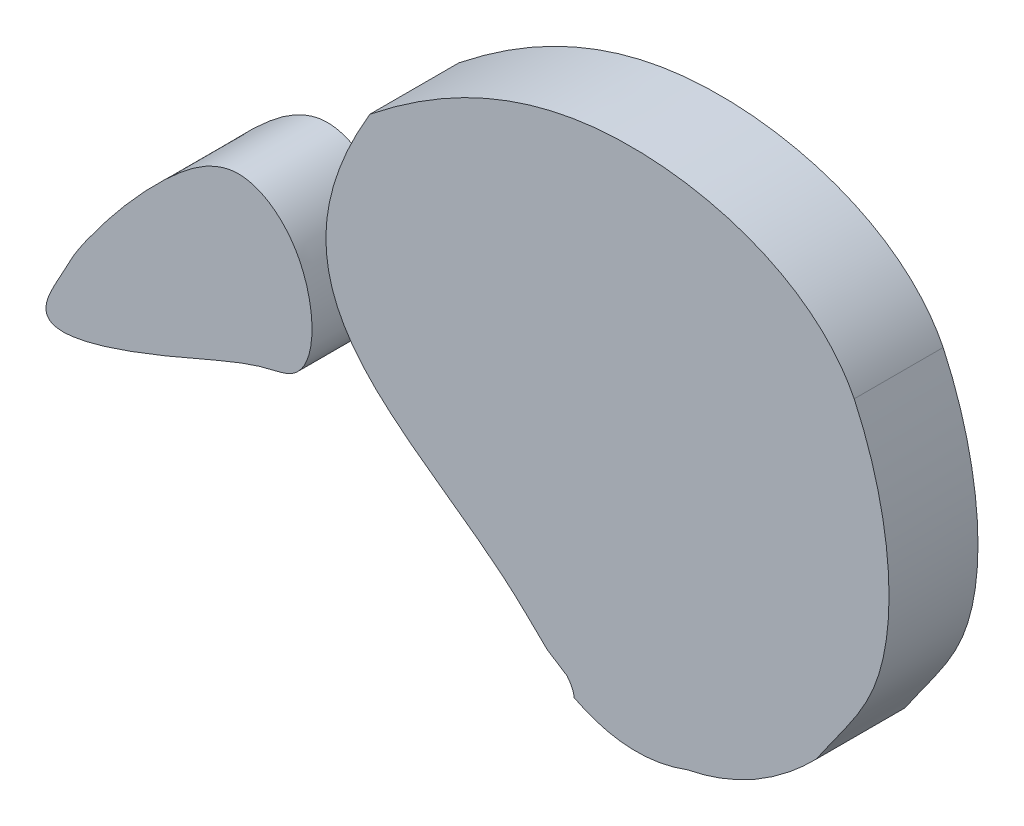
ISO-10303-21;
HEADER;
FILE_DESCRIPTION(('STEP AP214'),'2;1');
FILE_NAME('part.step','',(''),(''),'','','');
FILE_SCHEMA(('AUTOMOTIVE_DESIGN { 1 0 10303 214 1 1 1 1 }'));
ENDSEC;
DATA;
#1=APPLICATION_CONTEXT('core data for automotive mechanical design processes');
#2=APPLICATION_PROTOCOL_DEFINITION('international standard','automotive_design',2000,#1);
#3=PRODUCT_CONTEXT('',#1,'mechanical');
#4=PRODUCT('Part','Part','',(#3));
#5=PRODUCT_RELATED_PRODUCT_CATEGORY('part','',(#4));
#6=PRODUCT_DEFINITION_FORMATION('','',#4);
#7=PRODUCT_DEFINITION_CONTEXT('part definition',#1,'design');
#8=PRODUCT_DEFINITION('design','',#6,#7);
#9=PRODUCT_DEFINITION_SHAPE('','',#8);
#10=(LENGTH_UNIT() NAMED_UNIT(*) SI_UNIT(.MILLI.,.METRE.));
#11=(NAMED_UNIT(*) PLANE_ANGLE_UNIT() SI_UNIT($,.RADIAN.));
#12=(NAMED_UNIT(*) SI_UNIT($,.STERADIAN.) SOLID_ANGLE_UNIT());
#13=UNCERTAINTY_MEASURE_WITH_UNIT(LENGTH_MEASURE(1.E-05),#10,'distance_accuracy_value','');
#14=(GEOMETRIC_REPRESENTATION_CONTEXT(3) GLOBAL_UNCERTAINTY_ASSIGNED_CONTEXT((#13)) GLOBAL_UNIT_ASSIGNED_CONTEXT((#10,
#11,#12)) REPRESENTATION_CONTEXT('',''));
#15=CARTESIAN_POINT('',(0.,0.,0.));
#16=DIRECTION('',(0.,0.,1.));
#17=DIRECTION('',(1.,0.,0.));
#18=AXIS2_PLACEMENT_3D('',#15,#16,#17);
#19=CARTESIAN_POINT('',(-28.3902423523311,28.8973090137237,9.8));
#20=CARTESIAN_POINT('',(-26.5713886592162,31.4632090979087,9.8));
#21=CARTESIAN_POINT('',(-20.9532124526466,38.7162418127527,9.8));
#22=CARTESIAN_POINT('',(-11.8905383457723,45.2867117471239,9.8));
#23=CARTESIAN_POINT('',(-3.10016941693718,39.2693637235746,9.8));
#24=CARTESIAN_POINT('',(-2.78927548090348,27.4293616295983,9.8));
#25=CARTESIAN_POINT('',(-9.74025662267519,26.5320450092498,9.8));
#26=CARTESIAN_POINT('',(-38.710808990714,13.4203526333964,9.8));
#27=CARTESIAN_POINT('',(-31.5508679983338,22.6874814932975,9.8));
#28=CARTESIAN_POINT('',(-30.056508931191,26.5466671940129,9.8));
#29=CARTESIAN_POINT('',(-28.3902423523311,28.8973090137237,9.8));
#30=B_SPLINE_CURVE_WITH_KNOTS('',3,(#19,#20,#21,#22,#23,#24,#25,#26,#27,#28,#29),.UNSPECIFIED.,
.T.,.F.,(4,1,1,1,1,1,1,1,4),(0.,0.120347822003334,0.195890843614702,0.256651724543317,
0.359848027807498,0.390374162528509,0.443364198438644,0.889748386908841,1.),.UNSPECIFIED.);
#31=DIRECTION('',(0.,0.,-1.));
#32=VECTOR('',#31,1.);
#33=SURFACE_OF_LINEAR_EXTRUSION('',#30,#32);
#34=CARTESIAN_POINT('',(-28.3902423523311,28.8973090137237,9.8));
#35=VERTEX_POINT('',#34);
#36=EDGE_CURVE('E12',#35,#35,#30,.T.);
#37=ORIENTED_EDGE('',*,*,#36,.T.);
#38=EDGE_LOOP('',(#37));
#39=FACE_BOUND('',#38,.T.);
#40=CARTESIAN_POINT('',(-28.3902423523311,28.8973090137237,0.));
#41=CARTESIAN_POINT('',(-26.5713886592162,31.4632090979087,0.));
#42=CARTESIAN_POINT('',(-20.9532124526466,38.7162418127527,0.));
#43=CARTESIAN_POINT('',(-11.8905383457723,45.2867117471239,0.));
#44=CARTESIAN_POINT('',(-3.10016941693718,39.2693637235746,0.));
#45=CARTESIAN_POINT('',(-2.78927548090348,27.4293616295983,0.));
#46=CARTESIAN_POINT('',(-9.74025662267519,26.5320450092498,0.));
#47=CARTESIAN_POINT('',(-38.710808990714,13.4203526333964,0.));
#48=CARTESIAN_POINT('',(-31.5508679983338,22.6874814932975,0.));
#49=CARTESIAN_POINT('',(-30.056508931191,26.5466671940129,0.));
#50=CARTESIAN_POINT('',(-28.3902423523311,28.8973090137237,0.));
#51=B_SPLINE_CURVE_WITH_KNOTS('',3,(#40,#41,#42,#43,#44,#45,#46,#47,#48,#49,#50),.UNSPECIFIED.,
.T.,.F.,(4,1,1,1,1,1,1,1,4),(0.,0.120347822003334,0.195890843614702,0.256651724543317,
0.359848027807498,0.390374162528509,0.443364198438644,0.889748386908841,1.),.UNSPECIFIED.);
#52=CARTESIAN_POINT('',(-28.3902423523311,28.8973090137237,0.));
#53=VERTEX_POINT('',#52);
#54=EDGE_CURVE('E118',#53,#53,#51,.T.);
#55=ORIENTED_EDGE('',*,*,#54,.F.);
#56=EDGE_LOOP('',(#55));
#57=FACE_BOUND('',#56,.T.);
#58=ADVANCED_FACE('F114',(#39,#57),#33,.T.);
#59=CARTESIAN_POINT('',(0.,0.,9.8));
#60=DIRECTION('',(0.,0.,1.));
#61=DIRECTION('',(1.,0.,0.));
#62=AXIS2_PLACEMENT_3D('',#59,#60,#61);
#63=PLANE('',#62);
#64=ORIENTED_EDGE('',*,*,#36,.F.);
#65=EDGE_LOOP('',(#64));
#66=FACE_BOUND('',#65,.T.);
#67=ADVANCED_FACE('F137',(#66),#63,.T.);
#68=CARTESIAN_POINT('',(0.,0.,0.));
#69=DIRECTION('',(0.,0.,1.));
#70=DIRECTION('',(1.,0.,0.));
#71=AXIS2_PLACEMENT_3D('',#68,#69,#70);
#72=PLANE('',#71);
#73=ORIENTED_EDGE('',*,*,#54,.T.);
#74=EDGE_LOOP('',(#73));
#75=FACE_BOUND('',#74,.T.);
#76=ADVANCED_FACE('F134',(#75),#72,.F.);
#77=CLOSED_SHELL('',(#58,#67,#76));
#78=MANIFOLD_SOLID_BREP('B2',#77);
#79=CARTESIAN_POINT('',(37.8211398357284,11.4277403449907,9.8));
#80=CARTESIAN_POINT('',(31.2983827616135,8.97429833467415,9.8));
#81=CARTESIAN_POINT('',(25.2975764639562,12.0537958425906,9.8));
#82=B_SPLINE_CURVE_WITH_KNOTS('',2,(#79,#80,#81),.UNSPECIFIED.,.F.,.F.,(3,3),(0.,1.),.UNSPECIFIED.);
#83=DIRECTION('',(0.,0.,-1.));
#84=VECTOR('',#83,1.);
#85=SURFACE_OF_LINEAR_EXTRUSION('',#82,#84);
#86=CARTESIAN_POINT('',(37.8211398357284,11.4277403449907,0.));
#87=CARTESIAN_POINT('',(31.2983827616135,8.97429833467415,0.));
#88=CARTESIAN_POINT('',(25.2975764639562,12.0537958425906,0.));
#89=B_SPLINE_CURVE_WITH_KNOTS('',2,(#86,#87,#88),.UNSPECIFIED.,.F.,.F.,(3,3),(0.,1.),.UNSPECIFIED.);
#90=CARTESIAN_POINT('',(37.8211398357284,11.4277403449907,0.));
#91=VERTEX_POINT('',#90);
#92=CARTESIAN_POINT('',(25.2975764644121,12.0537958391927,0.));
#93=VERTEX_POINT('',#92);
#94=EDGE_CURVE('E324',#91,#93,#89,.T.);
#95=ORIENTED_EDGE('',*,*,#94,.F.);
#96=DIRECTION('',(0.,0.,-1.));
#97=VECTOR('',#96,1.);
#98=CARTESIAN_POINT('',(37.8211398357284,11.4277403449907,9.8));
#99=LINE('',#98,#97);
#100=CARTESIAN_POINT('',(37.8211398357284,11.4277403449907,9.8));
#101=VERTEX_POINT('',#100);
#102=EDGE_CURVE('E112',#101,#91,#99,.T.);
#103=ORIENTED_EDGE('',*,*,#102,.F.);
#104=CARTESIAN_POINT('',(25.2975764644121,12.0537958391927,9.8));
#105=VERTEX_POINT('',#104);
#106=EDGE_CURVE('E301',#101,#105,#82,.T.);
#107=ORIENTED_EDGE('',*,*,#106,.T.);
#108=DIRECTION('',(0.,0.,-1.));
#109=VECTOR('',#108,1.);
#110=CARTESIAN_POINT('',(25.2975764644121,12.0537958391927,9.8));
#111=LINE('',#110,#109);
#112=EDGE_CURVE('E217',#105,#93,#111,.T.);
#113=ORIENTED_EDGE('',*,*,#112,.T.);
#114=EDGE_LOOP('',(#95,#103,#107,#113));
#115=FACE_BOUND('',#114,.T.);
#116=ADVANCED_FACE('F168',(#115),#85,.T.);
#117=CARTESIAN_POINT('',(37.8211398357284,11.4277403449907,9.8));
#118=CARTESIAN_POINT('',(45.4854131323933,12.9577844561298,9.8));
#119=CARTESIAN_POINT('',(51.9460569732645,19.5146957271996,9.8));
#120=B_SPLINE_CURVE_WITH_KNOTS('',2,(#117,#118,#119),.UNSPECIFIED.,.F.,.F.,(3,3),
(0.435157314223848,1.),.UNSPECIFIED.);
#121=DIRECTION('',(0.,0.,-1.));
#122=VECTOR('',#121,1.);
#123=SURFACE_OF_LINEAR_EXTRUSION('',#120,#122);
#124=CARTESIAN_POINT('',(37.8211398357284,11.4277403449907,0.));
#125=CARTESIAN_POINT('',(45.4854131323933,12.9577844561298,0.));
#126=CARTESIAN_POINT('',(51.9460569732645,19.5146957271996,0.));
#127=B_SPLINE_CURVE_WITH_KNOTS('',2,(#124,#125,#126),.UNSPECIFIED.,.F.,.F.,(3,3),
(0.435157314223848,1.),.UNSPECIFIED.);
#128=CARTESIAN_POINT('',(51.9460569732645,19.5146957271996,0.));
#129=VERTEX_POINT('',#128);
#130=EDGE_CURVE('E319',#91,#129,#127,.T.);
#131=ORIENTED_EDGE('',*,*,#130,.T.);
#132=DIRECTION('',(0.,0.,-1.));
#133=VECTOR('',#132,1.);
#134=CARTESIAN_POINT('',(51.9460569732645,19.5146957271996,9.8));
#135=LINE('',#134,#133);
#136=CARTESIAN_POINT('',(51.9460569732645,19.5146957271996,9.8));
#137=VERTEX_POINT('',#136);
#138=EDGE_CURVE('E177',#137,#129,#135,.T.);
#139=ORIENTED_EDGE('',*,*,#138,.F.);
#140=EDGE_CURVE('E294',#101,#137,#120,.T.);
#141=ORIENTED_EDGE('',*,*,#140,.F.);
#142=ORIENTED_EDGE('',*,*,#102,.T.);
#143=EDGE_LOOP('',(#131,#139,#141,#142));
#144=FACE_BOUND('',#143,.T.);
#145=ADVANCED_FACE('F308',(#144),#123,.F.);
#146=CARTESIAN_POINT('',(39.6095497892832,70.8961174142382,9.8));
#147=CARTESIAN_POINT('',(47.0123878353108,68.3178288678129,9.8));
#148=CARTESIAN_POINT('',(58.3752557208595,58.4182183450739,9.8));
#149=CARTESIAN_POINT('',(62.3747237747644,32.3528735853902,9.8));
#150=CARTESIAN_POINT('',(54.3258110881676,23.0431282968841,9.8));
#151=CARTESIAN_POINT('',(51.9460569732645,19.5146957271995,9.8));
#152=B_SPLINE_CURVE_WITH_KNOTS('',3,(#146,#147,#148,#149,#150,#151),.UNSPECIFIED.,.F.,.F.,(4,1,
1,4),(0.00520266082699301,0.309690794821802,0.684334568619733,0.840119750989101),.UNSPECIFIED.);
#153=DIRECTION('',(0.,0.,-1.));
#154=VECTOR('',#153,1.);
#155=SURFACE_OF_LINEAR_EXTRUSION('',#152,#154);
#156=CARTESIAN_POINT('',(39.6095497892832,70.8961174142382,0.));
#157=CARTESIAN_POINT('',(47.0123878353108,68.3178288678129,0.));
#158=CARTESIAN_POINT('',(58.3752557208595,58.4182183450739,0.));
#159=CARTESIAN_POINT('',(62.3747237747644,32.3528735853902,0.));
#160=CARTESIAN_POINT('',(54.3258110881676,23.0431282968841,0.));
#161=CARTESIAN_POINT('',(51.9460569732645,19.5146957271995,0.));
#162=B_SPLINE_CURVE_WITH_KNOTS('',3,(#156,#157,#158,#159,#160,#161),.UNSPECIFIED.,.F.,.F.,(4,1,
1,4),(0.00520266082699301,0.309690794821802,0.684334568619733,0.840119750989101),.UNSPECIFIED.);
#163=CARTESIAN_POINT('',(56.1462722876964,56.0026222725421,0.));
#164=VERTEX_POINT('',#163);
#165=EDGE_CURVE('E323',#164,#129,#162,.T.);
#166=ORIENTED_EDGE('',*,*,#165,.F.);
#167=DIRECTION('',(0.,0.,-1.));
#168=VECTOR('',#167,1.);
#169=CARTESIAN_POINT('',(56.1462722876964,56.0026222725421,9.8));
#170=LINE('',#169,#168);
#171=CARTESIAN_POINT('',(56.1462722876964,56.0026222725421,9.8));
#172=VERTEX_POINT('',#171);
#173=EDGE_CURVE('E368',#172,#164,#170,.T.);
#174=ORIENTED_EDGE('',*,*,#173,.F.);
#175=EDGE_CURVE('E285',#172,#137,#152,.T.);
#176=ORIENTED_EDGE('',*,*,#175,.T.);
#177=ORIENTED_EDGE('',*,*,#138,.T.);
#178=EDGE_LOOP('',(#166,#174,#176,#177));
#179=FACE_BOUND('',#178,.T.);
#180=ADVANCED_FACE('F279',(#179),#155,.T.);
#181=CARTESIAN_POINT('',(2.78157023495851,56.4778755727566,9.8));
#182=CARTESIAN_POINT('',(9.75505173456173,62.0195083270774,9.8));
#183=CARTESIAN_POINT('',(27.3967479811564,71.9932714494889,9.8));
#184=CARTESIAN_POINT('',(52.444202769317,64.8941986857286,9.8));
#185=CARTESIAN_POINT('',(56.5463486284125,55.127707577663,9.8));
#186=B_SPLINE_CURVE_WITH_KNOTS('',3,(#181,#182,#183,#184,#185),.UNSPECIFIED.,.F.,.F.,(4,1,4),
(0.,0.46260532823252,1.),.UNSPECIFIED.);
#187=DIRECTION('',(0.,0.,-1.));
#188=VECTOR('',#187,1.);
#189=SURFACE_OF_LINEAR_EXTRUSION('',#186,#188);
#190=CARTESIAN_POINT('',(2.78157023495851,56.4778755727566,0.));
#191=CARTESIAN_POINT('',(9.75505173456173,62.0195083270774,0.));
#192=CARTESIAN_POINT('',(27.3967479811564,71.9932714494889,0.));
#193=CARTESIAN_POINT('',(52.444202769317,64.8941986857286,0.));
#194=CARTESIAN_POINT('',(56.5463486284125,55.127707577663,0.));
#195=B_SPLINE_CURVE_WITH_KNOTS('',3,(#190,#191,#192,#193,#194),.UNSPECIFIED.,.F.,.F.,(4,1,4),
(0.,0.46260532823252,1.),.UNSPECIFIED.);
#196=CARTESIAN_POINT('',(2.78157023495851,56.4778755727566,0.));
#197=VERTEX_POINT('',#196);
#198=EDGE_CURVE('E330',#197,#164,#195,.T.);
#199=ORIENTED_EDGE('',*,*,#198,.F.);
#200=DIRECTION('',(0.,0.,-1.));
#201=VECTOR('',#200,1.);
#202=CARTESIAN_POINT('',(2.78157023495851,56.4778755727566,9.8));
#203=LINE('',#202,#201);
#204=CARTESIAN_POINT('',(2.78157023495851,56.4778755727566,9.8));
#205=VERTEX_POINT('',#204);
#206=EDGE_CURVE('E248',#205,#197,#203,.T.);
#207=ORIENTED_EDGE('',*,*,#206,.F.);
#208=EDGE_CURVE('E241',#205,#172,#186,.T.);
#209=ORIENTED_EDGE('',*,*,#208,.T.);
#210=ORIENTED_EDGE('',*,*,#173,.T.);
#211=EDGE_LOOP('',(#199,#207,#209,#210));
#212=FACE_BOUND('',#211,.T.);
#213=ADVANCED_FACE('F276',(#212),#189,.T.);
#214=CARTESIAN_POINT('',(2.78157023495851,56.4778755727566,9.8));
#215=CARTESIAN_POINT('',(-10.9181701920679,33.3522717841158,9.8));
#216=CARTESIAN_POINT('',(9.3737489216548,28.4412942857522,9.8));
#217=CARTESIAN_POINT('',(21.2758968242971,16.1363417375195,9.8));
#218=CARTESIAN_POINT('',(22.3295883280873,15.1510013995163,9.8));
#219=B_SPLINE_CURVE_WITH_KNOTS('',3,(#214,#215,#216,#217,#218),.UNSPECIFIED.,.F.,.F.,(4,1,4),
(0.,0.747546219200271,0.818239289465083),.UNSPECIFIED.);
#220=DIRECTION('',(0.,0.,-1.));
#221=VECTOR('',#220,1.);
#222=SURFACE_OF_LINEAR_EXTRUSION('',#219,#221);
#223=CARTESIAN_POINT('',(2.78157023495851,56.4778755727566,0.));
#224=CARTESIAN_POINT('',(-10.9181701920679,33.3522717841158,0.));
#225=CARTESIAN_POINT('',(9.3737489216548,28.4412942857522,0.));
#226=CARTESIAN_POINT('',(21.2758968242971,16.1363417375195,0.));
#227=CARTESIAN_POINT('',(22.3295883280873,15.1510013995163,0.));
#228=B_SPLINE_CURVE_WITH_KNOTS('',3,(#223,#224,#225,#226,#227),.UNSPECIFIED.,.F.,.F.,(4,1,4),
(0.,0.747546219200271,0.818239289465083),.UNSPECIFIED.);
#229=CARTESIAN_POINT('',(22.3295883280881,15.1510013995158,0.));
#230=VERTEX_POINT('',#229);
#231=EDGE_CURVE('E247',#197,#230,#228,.T.);
#232=ORIENTED_EDGE('',*,*,#231,.T.);
#233=DIRECTION('',(0.,0.,-1.));
#234=VECTOR('',#233,1.);
#235=CARTESIAN_POINT('',(22.3295883280881,15.1510013995158,9.8));
#236=LINE('',#235,#234);
#237=CARTESIAN_POINT('',(22.3295883280881,15.1510013995158,9.8));
#238=VERTEX_POINT('',#237);
#239=EDGE_CURVE('E244',#238,#230,#236,.T.);
#240=ORIENTED_EDGE('',*,*,#239,.F.);
#241=EDGE_CURVE('E234',#205,#238,#219,.T.);
#242=ORIENTED_EDGE('',*,*,#241,.F.);
#243=ORIENTED_EDGE('',*,*,#206,.T.);
#244=EDGE_LOOP('',(#232,#240,#242,#243));
#245=FACE_BOUND('',#244,.T.);
#246=ADVANCED_FACE('F245',(#245),#222,.F.);
#247=CARTESIAN_POINT('',(-81.2929034918169,-36.278328661653,9.8));
#248=CARTESIAN_POINT('',(-67.8471865122681,-12.0192188338044,9.8));
#249=CARTESIAN_POINT('',(-36.8817974497271,18.832507342674,9.8));
#250=CARTESIAN_POINT('',(6.05401980057526,26.1158647437927,9.8));
#251=CARTESIAN_POINT('',(24.5041322410582,13.7599801557885,9.8));
#252=B_SPLINE_CURVE_WITH_KNOTS('',3,(#247,#248,#249,#250,#251),.UNSPECIFIED.,.F.,.F.,(4,1,4),
(0.,0.593504623180425,0.977243459732475),.UNSPECIFIED.);
#253=DIRECTION('',(0.,0.,-1.));
#254=VECTOR('',#253,1.);
#255=SURFACE_OF_LINEAR_EXTRUSION('',#252,#254);
#256=CARTESIAN_POINT('',(-81.2929034918169,-36.278328661653,0.));
#257=CARTESIAN_POINT('',(-67.8471865122681,-12.0192188338044,0.));
#258=CARTESIAN_POINT('',(-36.8817974497271,18.832507342674,0.));
#259=CARTESIAN_POINT('',(6.05401980057526,26.1158647437927,0.));
#260=CARTESIAN_POINT('',(24.5041322410582,13.7599801557885,0.));
#261=B_SPLINE_CURVE_WITH_KNOTS('',3,(#256,#257,#258,#259,#260),.UNSPECIFIED.,.F.,.F.,(4,1,4),
(0.,0.593504623180425,0.977243459732475),.UNSPECIFIED.);
#262=CARTESIAN_POINT('',(24.5041322410582,13.7599801557885,0.));
#263=VERTEX_POINT('',#262);
#264=EDGE_CURVE('E210',#230,#263,#261,.T.);
#265=ORIENTED_EDGE('',*,*,#264,.T.);
#266=DIRECTION('',(0.,0.,-1.));
#267=VECTOR('',#266,1.);
#268=CARTESIAN_POINT('',(24.5041322410582,13.7599801557885,9.8));
#269=LINE('',#268,#267);
#270=CARTESIAN_POINT('',(24.5041322410582,13.7599801557885,9.8));
#271=VERTEX_POINT('',#270);
#272=EDGE_CURVE('E249',#271,#263,#269,.T.);
#273=ORIENTED_EDGE('',*,*,#272,.F.);
#274=EDGE_CURVE('E238',#238,#271,#252,.T.);
#275=ORIENTED_EDGE('',*,*,#274,.F.);
#276=ORIENTED_EDGE('',*,*,#239,.T.);
#277=EDGE_LOOP('',(#265,#273,#275,#276));
#278=FACE_BOUND('',#277,.T.);
#279=ADVANCED_FACE('F251',(#278),#255,.F.);
#280=CARTESIAN_POINT('',(24.5041322410582,13.7599801557885,9.8));
#281=CARTESIAN_POINT('',(24.9644478542577,13.224605022843,9.8));
#282=CARTESIAN_POINT('',(26.2669521757503,10.2701569158686,9.8));
#283=CARTESIAN_POINT('',(20.9375555985191,4.48454614430363,9.8));
#284=CARTESIAN_POINT('',(14.5873934036668,1.68197608500073,9.8));
#285=CARTESIAN_POINT('',(12.63960649323,1.41752597693031,9.8));
#286=B_SPLINE_CURVE_WITH_KNOTS('',3,(#280,#281,#282,#283,#284,#285),.UNSPECIFIED.,.F.,.F.,(4,1,
1,4),(0.123396326010415,0.218579713415603,0.613348411571861,0.9194811869661),.UNSPECIFIED.);
#287=DIRECTION('',(0.,0.,-1.));
#288=VECTOR('',#287,1.);
#289=SURFACE_OF_LINEAR_EXTRUSION('',#286,#288);
#290=CARTESIAN_POINT('',(24.5041322410582,13.7599801557885,0.));
#291=CARTESIAN_POINT('',(24.9644478542577,13.224605022843,0.));
#292=CARTESIAN_POINT('',(26.2669521757503,10.2701569158686,0.));
#293=CARTESIAN_POINT('',(20.9375555985191,4.48454614430363,0.));
#294=CARTESIAN_POINT('',(14.5873934036668,1.68197608500073,0.));
#295=CARTESIAN_POINT('',(12.63960649323,1.41752597693031,0.));
#296=B_SPLINE_CURVE_WITH_KNOTS('',3,(#290,#291,#292,#293,#294,#295),.UNSPECIFIED.,.F.,.F.,(4,1,
1,4),(0.123396326010415,0.218579713415603,0.613348411571861,0.9194811869661),.UNSPECIFIED.);
#297=EDGE_CURVE('E355',#263,#93,#296,.T.);
#298=ORIENTED_EDGE('',*,*,#297,.T.);
#299=ORIENTED_EDGE('',*,*,#112,.F.);
#300=EDGE_CURVE('E185',#271,#105,#286,.T.);
#301=ORIENTED_EDGE('',*,*,#300,.F.);
#302=ORIENTED_EDGE('',*,*,#272,.T.);
#303=EDGE_LOOP('',(#298,#299,#301,#302));
#304=FACE_BOUND('',#303,.T.);
#305=ADVANCED_FACE('F272',(#304),#289,.F.);
#306=CARTESIAN_POINT('',(0.,0.,9.8));
#307=DIRECTION('',(0.,0.,1.));
#308=DIRECTION('',(1.,0.,0.));
#309=AXIS2_PLACEMENT_3D('',#306,#307,#308);
#310=PLANE('',#309);
#311=ORIENTED_EDGE('',*,*,#106,.F.);
#312=ORIENTED_EDGE('',*,*,#140,.T.);
#313=ORIENTED_EDGE('',*,*,#175,.F.);
#314=ORIENTED_EDGE('',*,*,#208,.F.);
#315=ORIENTED_EDGE('',*,*,#241,.T.);
#316=ORIENTED_EDGE('',*,*,#274,.T.);
#317=ORIENTED_EDGE('',*,*,#300,.T.);
#318=EDGE_LOOP('',(#311,#312,#313,#314,#315,#316,#317));
#319=FACE_BOUND('',#318,.T.);
#320=ADVANCED_FACE('F236',(#319),#310,.T.);
#321=CARTESIAN_POINT('',(0.,0.,0.));
#322=DIRECTION('',(0.,0.,1.));
#323=DIRECTION('',(1.,0.,0.));
#324=AXIS2_PLACEMENT_3D('',#321,#322,#323);
#325=PLANE('',#324);
#326=ORIENTED_EDGE('',*,*,#94,.T.);
#327=ORIENTED_EDGE('',*,*,#297,.F.);
#328=ORIENTED_EDGE('',*,*,#264,.F.);
#329=ORIENTED_EDGE('',*,*,#231,.F.);
#330=ORIENTED_EDGE('',*,*,#198,.T.);
#331=ORIENTED_EDGE('',*,*,#165,.T.);
#332=ORIENTED_EDGE('',*,*,#130,.F.);
#333=EDGE_LOOP('',(#326,#327,#328,#329,#330,#331,#332));
#334=FACE_BOUND('',#333,.T.);
#335=ADVANCED_FACE('F328',(#334),#325,.F.);
#336=CLOSED_SHELL('',(#116,#145,#180,#213,#246,#279,#305,#320,#335));
#337=MANIFOLD_SOLID_BREP('B7',#336);
#338=ADVANCED_BREP_SHAPE_REPRESENTATION('',(#18,#78,#337),#14);
#339=SHAPE_DEFINITION_REPRESENTATION(#9,#338);
ENDSEC;
END-ISO-10303-21;
